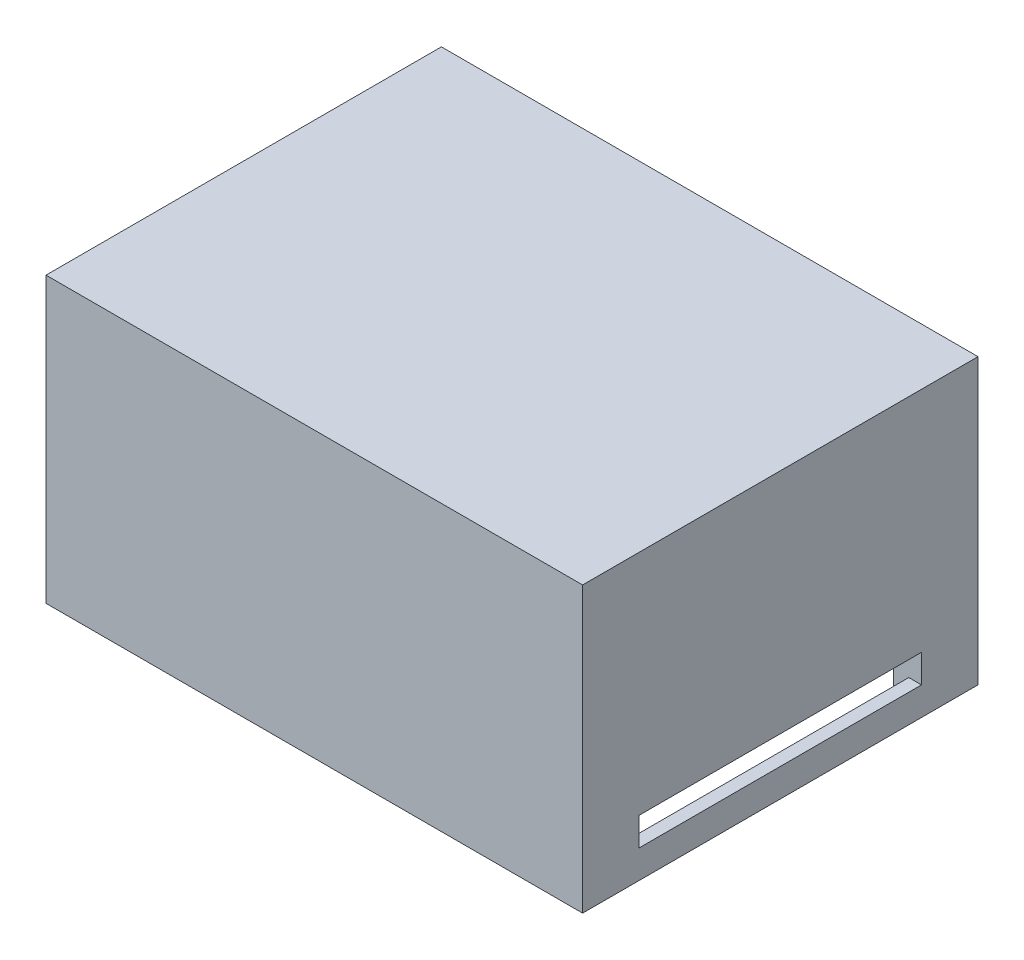
ISO-10303-21;
HEADER;
FILE_DESCRIPTION(('STEP AP214'),'2;1');
FILE_NAME('part.step','',(''),(''),'','','');
FILE_SCHEMA(('AUTOMOTIVE_DESIGN { 1 0 10303 214 1 1 1 1 }'));
ENDSEC;
DATA;
#1=APPLICATION_CONTEXT('core data for automotive mechanical design processes');
#2=APPLICATION_PROTOCOL_DEFINITION('international standard','automotive_design',2000,#1);
#3=PRODUCT_CONTEXT('',#1,'mechanical');
#4=PRODUCT('Part','Part','',(#3));
#5=PRODUCT_RELATED_PRODUCT_CATEGORY('part','',(#4));
#6=PRODUCT_DEFINITION_FORMATION('','',#4);
#7=PRODUCT_DEFINITION_CONTEXT('part definition',#1,'design');
#8=PRODUCT_DEFINITION('design','',#6,#7);
#9=PRODUCT_DEFINITION_SHAPE('','',#8);
#10=(LENGTH_UNIT() NAMED_UNIT(*) SI_UNIT(.MILLI.,.METRE.));
#11=(NAMED_UNIT(*) PLANE_ANGLE_UNIT() SI_UNIT($,.RADIAN.));
#12=(NAMED_UNIT(*) SI_UNIT($,.STERADIAN.) SOLID_ANGLE_UNIT());
#13=UNCERTAINTY_MEASURE_WITH_UNIT(LENGTH_MEASURE(1.E-05),#10,'distance_accuracy_value','');
#14=(GEOMETRIC_REPRESENTATION_CONTEXT(3) GLOBAL_UNCERTAINTY_ASSIGNED_CONTEXT((#13)) GLOBAL_UNIT_ASSIGNED_CONTEXT((#10,
#11,#12)) REPRESENTATION_CONTEXT('',''));
#15=CARTESIAN_POINT('',(0.,0.,0.));
#16=DIRECTION('',(0.,0.,1.));
#17=DIRECTION('',(1.,0.,0.));
#18=AXIS2_PLACEMENT_3D('',#15,#16,#17);
#19=CARTESIAN_POINT('',(0.,0.,17.78));
#20=DIRECTION('',(1.,0.,0.));
#21=DIRECTION('',(0.,1.,0.));
#22=AXIS2_PLACEMENT_3D('',#19,#20,#21);
#23=PLANE('',#22);
#24=DIRECTION('',(0.,-1.,0.));
#25=VECTOR('',#24,1.);
#26=CARTESIAN_POINT('',(0.,0.,-17.78));
#27=LINE('',#26,#25);
#28=CARTESIAN_POINT('',(0.,0.,-17.78));
#29=VERTEX_POINT('',#28);
#30=CARTESIAN_POINT('',(0.,-25.5651,-17.78));
#31=VERTEX_POINT('',#30);
#32=EDGE_CURVE('E214',#29,#31,#27,.T.);
#33=ORIENTED_EDGE('',*,*,#32,.T.);
#34=DIRECTION('',(0.,0.,-1.));
#35=VECTOR('',#34,1.);
#36=CARTESIAN_POINT('',(0.,-25.5651,17.78));
#37=LINE('',#36,#35);
#38=CARTESIAN_POINT('',(0.,-25.5651,17.78));
#39=VERTEX_POINT('',#38);
#40=EDGE_CURVE('E55',#39,#31,#37,.T.);
#41=ORIENTED_EDGE('',*,*,#40,.F.);
#42=DIRECTION('',(0.,-1.,0.));
#43=VECTOR('',#42,1.);
#44=CARTESIAN_POINT('',(0.,0.,17.78));
#45=LINE('',#44,#43);
#46=CARTESIAN_POINT('',(0.,0.,17.78));
#47=VERTEX_POINT('',#46);
#48=EDGE_CURVE('E229',#47,#39,#45,.T.);
#49=ORIENTED_EDGE('',*,*,#48,.F.);
#50=DIRECTION('',(0.,0.,-1.));
#51=VECTOR('',#50,1.);
#52=CARTESIAN_POINT('',(0.,0.,17.78));
#53=LINE('',#52,#51);
#54=EDGE_CURVE('E245',#47,#29,#53,.T.);
#55=ORIENTED_EDGE('',*,*,#54,.T.);
#56=EDGE_LOOP('',(#33,#41,#49,#55));
#57=FACE_BOUND('',#56,.T.);
#58=DIRECTION('',(0.,-1.,0.));
#59=VECTOR('',#58,1.);
#60=CARTESIAN_POINT('',(0.,-20.4851,-12.7));
#61=LINE('',#60,#59);
#62=CARTESIAN_POINT('',(0.,-20.4851,-12.7));
#63=VERTEX_POINT('',#62);
#64=CARTESIAN_POINT('',(0.,-23.0251,-12.7));
#65=VERTEX_POINT('',#64);
#66=EDGE_CURVE('E596',#63,#65,#61,.T.);
#67=ORIENTED_EDGE('',*,*,#66,.F.);
#68=DIRECTION('',(0.,0.,1.));
#69=VECTOR('',#68,1.);
#70=CARTESIAN_POINT('',(0.,-20.4851,-12.7));
#71=LINE('',#70,#69);
#72=CARTESIAN_POINT('',(0.,-20.4851,12.7));
#73=VERTEX_POINT('',#72);
#74=EDGE_CURVE('E367',#63,#73,#71,.T.);
#75=ORIENTED_EDGE('',*,*,#74,.T.);
#76=DIRECTION('',(0.,-1.,0.));
#77=VECTOR('',#76,1.);
#78=CARTESIAN_POINT('',(0.,-20.4851,12.7));
#79=LINE('',#78,#77);
#80=CARTESIAN_POINT('',(0.,-23.0251,12.7));
#81=VERTEX_POINT('',#80);
#82=EDGE_CURVE('E353',#73,#81,#79,.T.);
#83=ORIENTED_EDGE('',*,*,#82,.T.);
#84=DIRECTION('',(0.,0.,1.));
#85=VECTOR('',#84,1.);
#86=CARTESIAN_POINT('',(0.,-23.0251,-12.7));
#87=LINE('',#86,#85);
#88=EDGE_CURVE('E366',#65,#81,#87,.T.);
#89=ORIENTED_EDGE('',*,*,#88,.F.);
#90=EDGE_LOOP('',(#67,#75,#83,#89));
#91=FACE_BOUND('',#90,.T.);
#92=ADVANCED_FACE('F44',(#57,#91),#23,.F.);
#93=CARTESIAN_POINT('',(2.54,0.,17.78));
#94=DIRECTION('',(1.,0.,0.));
#95=DIRECTION('',(0.,1.,0.));
#96=AXIS2_PLACEMENT_3D('',#93,#94,#95);
#97=PLANE('',#96);
#98=DIRECTION('',(0.,0.,-1.));
#99=VECTOR('',#98,1.);
#100=CARTESIAN_POINT('',(2.54,-25.5651,17.78));
#101=LINE('',#100,#99);
#102=CARTESIAN_POINT('',(2.54,-25.5651,15.24));
#103=VERTEX_POINT('',#102);
#104=CARTESIAN_POINT('',(2.54,-25.5651,12.7));
#105=VERTEX_POINT('',#104);
#106=EDGE_CURVE('E215',#103,#105,#101,.T.);
#107=ORIENTED_EDGE('',*,*,#106,.T.);
#108=DIRECTION('',(0.,1.,0.));
#109=VECTOR('',#108,1.);
#110=CARTESIAN_POINT('',(2.54,-25.5651,12.7));
#111=LINE('',#110,#109);
#112=CARTESIAN_POINT('',(2.54,-20.4851,12.7));
#113=VERTEX_POINT('',#112);
#114=EDGE_CURVE('E349',#105,#113,#111,.T.);
#115=ORIENTED_EDGE('',*,*,#114,.T.);
#116=DIRECTION('',(0.,0.,1.));
#117=VECTOR('',#116,1.);
#118=CARTESIAN_POINT('',(2.54,-20.4851,-12.7));
#119=LINE('',#118,#117);
#120=CARTESIAN_POINT('',(2.54,-20.4851,-12.7));
#121=VERTEX_POINT('',#120);
#122=EDGE_CURVE('E204',#121,#113,#119,.T.);
#123=ORIENTED_EDGE('',*,*,#122,.F.);
#124=DIRECTION('',(0.,1.,0.));
#125=VECTOR('',#124,1.);
#126=CARTESIAN_POINT('',(2.54,-25.5651,-12.7));
#127=LINE('',#126,#125);
#128=CARTESIAN_POINT('',(2.54,-25.5651,-12.7));
#129=VERTEX_POINT('',#128);
#130=EDGE_CURVE('E186',#129,#121,#127,.T.);
#131=ORIENTED_EDGE('',*,*,#130,.F.);
#132=CARTESIAN_POINT('',(2.54,-25.5651,-15.24));
#133=VERTEX_POINT('',#132);
#134=EDGE_CURVE('E203',#129,#133,#101,.T.);
#135=ORIENTED_EDGE('',*,*,#134,.T.);
#136=DIRECTION('',(0.,-1.,0.));
#137=VECTOR('',#136,1.);
#138=CARTESIAN_POINT('',(2.54,0.,-15.24));
#139=LINE('',#138,#137);
#140=CARTESIAN_POINT('',(2.54,-2.54,-15.24));
#141=VERTEX_POINT('',#140);
#142=EDGE_CURVE('E221',#141,#133,#139,.T.);
#143=ORIENTED_EDGE('',*,*,#142,.F.);
#144=DIRECTION('',(0.,0.,-1.));
#145=VECTOR('',#144,1.);
#146=CARTESIAN_POINT('',(2.54,-2.54,17.78));
#147=LINE('',#146,#145);
#148=CARTESIAN_POINT('',(2.54,-2.54,15.24));
#149=VERTEX_POINT('',#148);
#150=EDGE_CURVE('E329',#149,#141,#147,.T.);
#151=ORIENTED_EDGE('',*,*,#150,.F.);
#152=DIRECTION('',(0.,-1.,0.));
#153=VECTOR('',#152,1.);
#154=CARTESIAN_POINT('',(2.54,0.,15.24));
#155=LINE('',#154,#153);
#156=EDGE_CURVE('E228',#149,#103,#155,.T.);
#157=ORIENTED_EDGE('',*,*,#156,.T.);
#158=EDGE_LOOP('',(#107,#115,#123,#131,#135,#143,#151,#157));
#159=FACE_BOUND('',#158,.T.);
#160=ADVANCED_FACE('F200',(#159),#97,.T.);
#161=CARTESIAN_POINT('',(0.,-25.5651,17.78));
#162=DIRECTION('',(0.,1.,0.));
#163=DIRECTION('',(0.,0.,1.));
#164=AXIS2_PLACEMENT_3D('',#161,#162,#163);
#165=PLANE('',#164);
#166=DIRECTION('',(0.,0.,1.));
#167=VECTOR('',#166,1.);
#168=CARTESIAN_POINT('',(0.508,-25.5651,-12.7));
#169=LINE('',#168,#167);
#170=CARTESIAN_POINT('',(0.508,-25.5651,-12.7));
#171=VERTEX_POINT('',#170);
#172=CARTESIAN_POINT('',(0.508,-25.5651,12.7));
#173=VERTEX_POINT('',#172);
#174=EDGE_CURVE('E324',#171,#173,#169,.T.);
#175=ORIENTED_EDGE('',*,*,#174,.T.);
#176=DIRECTION('',(1.,0.,0.));
#177=VECTOR('',#176,1.);
#178=CARTESIAN_POINT('',(0.508,-25.5651,12.7));
#179=LINE('',#178,#177);
#180=EDGE_CURVE('E346',#173,#105,#179,.T.);
#181=ORIENTED_EDGE('',*,*,#180,.T.);
#182=ORIENTED_EDGE('',*,*,#106,.F.);
#183=DIRECTION('',(1.,0.,0.));
#184=VECTOR('',#183,1.);
#185=CARTESIAN_POINT('',(0.,-25.5651,15.24));
#186=LINE('',#185,#184);
#187=CARTESIAN_POINT('',(45.72,-25.5651,15.24));
#188=VERTEX_POINT('',#187);
#189=EDGE_CURVE('E226',#103,#188,#186,.T.);
#190=ORIENTED_EDGE('',*,*,#189,.T.);
#191=DIRECTION('',(0.,0.,-1.));
#192=VECTOR('',#191,1.);
#193=CARTESIAN_POINT('',(45.72,-25.5651,17.78));
#194=LINE('',#193,#192);
#195=CARTESIAN_POINT('',(45.72,-25.5651,12.7));
#196=VERTEX_POINT('',#195);
#197=EDGE_CURVE('E213',#188,#196,#194,.T.);
#198=ORIENTED_EDGE('',*,*,#197,.T.);
#199=DIRECTION('',(1.,0.,0.));
#200=VECTOR('',#199,1.);
#201=CARTESIAN_POINT('',(45.72,-25.5651,12.7));
#202=LINE('',#201,#200);
#203=CARTESIAN_POINT('',(47.752,-25.5651,12.7));
#204=VERTEX_POINT('',#203);
#205=EDGE_CURVE('E358',#196,#204,#202,.T.);
#206=ORIENTED_EDGE('',*,*,#205,.T.);
#207=DIRECTION('',(0.,0.,1.));
#208=VECTOR('',#207,1.);
#209=CARTESIAN_POINT('',(47.752,-25.5651,-12.7));
#210=LINE('',#209,#208);
#211=CARTESIAN_POINT('',(47.752,-25.5651,-12.7));
#212=VERTEX_POINT('',#211);
#213=EDGE_CURVE('E372',#212,#204,#210,.T.);
#214=ORIENTED_EDGE('',*,*,#213,.F.);
#215=DIRECTION('',(1.,0.,0.));
#216=VECTOR('',#215,1.);
#217=CARTESIAN_POINT('',(45.72,-25.5651,-12.7));
#218=LINE('',#217,#216);
#219=CARTESIAN_POINT('',(45.72,-25.5651,-12.7));
#220=VERTEX_POINT('',#219);
#221=EDGE_CURVE('E386',#220,#212,#218,.T.);
#222=ORIENTED_EDGE('',*,*,#221,.F.);
#223=CARTESIAN_POINT('',(45.72,-25.5651,-15.24));
#224=VERTEX_POINT('',#223);
#225=EDGE_CURVE('E220',#220,#224,#194,.T.);
#226=ORIENTED_EDGE('',*,*,#225,.T.);
#227=DIRECTION('',(1.,0.,0.));
#228=VECTOR('',#227,1.);
#229=CARTESIAN_POINT('',(0.,-25.5651,-15.24));
#230=LINE('',#229,#228);
#231=EDGE_CURVE('E211',#133,#224,#230,.T.);
#232=ORIENTED_EDGE('',*,*,#231,.F.);
#233=ORIENTED_EDGE('',*,*,#134,.F.);
#234=DIRECTION('',(1.,0.,0.));
#235=VECTOR('',#234,1.);
#236=CARTESIAN_POINT('',(0.508,-25.5651,-12.7));
#237=LINE('',#236,#235);
#238=EDGE_CURVE('E185',#171,#129,#237,.T.);
#239=ORIENTED_EDGE('',*,*,#238,.F.);
#240=EDGE_LOOP('',(#175,#181,#182,#190,#198,#206,#214,#222,#226,#232,#233,#239));
#241=FACE_BOUND('',#240,.T.);
#242=DIRECTION('',(1.,0.,0.));
#243=VECTOR('',#242,1.);
#244=CARTESIAN_POINT('',(0.,-25.5651,-17.78));
#245=LINE('',#244,#243);
#246=CARTESIAN_POINT('',(48.26,-25.5651,-17.78));
#247=VERTEX_POINT('',#246);
#248=EDGE_CURVE('E244',#31,#247,#245,.T.);
#249=ORIENTED_EDGE('',*,*,#248,.T.);
#250=DIRECTION('',(0.,0.,-1.));
#251=VECTOR('',#250,1.);
#252=CARTESIAN_POINT('',(48.26,-25.5651,17.78));
#253=LINE('',#252,#251);
#254=CARTESIAN_POINT('',(48.26,-25.5651,17.78));
#255=VERTEX_POINT('',#254);
#256=EDGE_CURVE('E258',#255,#247,#253,.T.);
#257=ORIENTED_EDGE('',*,*,#256,.F.);
#258=DIRECTION('',(1.,0.,0.));
#259=VECTOR('',#258,1.);
#260=CARTESIAN_POINT('',(0.,-25.5651,17.78));
#261=LINE('',#260,#259);
#262=EDGE_CURVE('E232',#39,#255,#261,.T.);
#263=ORIENTED_EDGE('',*,*,#262,.F.);
#264=ORIENTED_EDGE('',*,*,#40,.T.);
#265=EDGE_LOOP('',(#249,#257,#263,#264));
#266=FACE_BOUND('',#265,.T.);
#267=ADVANCED_FACE('F208',(#241,#266),#165,.F.);
#268=CARTESIAN_POINT('',(48.26,0.,17.78));
#269=DIRECTION('',(1.,0.,0.));
#270=DIRECTION('',(0.,0.,-1.));
#271=AXIS2_PLACEMENT_3D('',#268,#269,#270);
#272=PLANE('',#271);
#273=DIRECTION('',(0.,1.,0.));
#274=VECTOR('',#273,1.);
#275=CARTESIAN_POINT('',(48.26,-23.0251,-12.7));
#276=LINE('',#275,#274);
#277=CARTESIAN_POINT('',(48.26,-23.0251,-12.7));
#278=VERTEX_POINT('',#277);
#279=CARTESIAN_POINT('',(48.26,-20.4851,-12.7));
#280=VERTEX_POINT('',#279);
#281=EDGE_CURVE('E406',#278,#280,#276,.T.);
#282=ORIENTED_EDGE('',*,*,#281,.F.);
#283=DIRECTION('',(0.,0.,1.));
#284=VECTOR('',#283,1.);
#285=CARTESIAN_POINT('',(48.26,-23.0251,-12.7));
#286=LINE('',#285,#284);
#287=CARTESIAN_POINT('',(48.26,-23.0251,12.7));
#288=VERTEX_POINT('',#287);
#289=EDGE_CURVE('E377',#278,#288,#286,.T.);
#290=ORIENTED_EDGE('',*,*,#289,.T.);
#291=DIRECTION('',(0.,1.,0.));
#292=VECTOR('',#291,1.);
#293=CARTESIAN_POINT('',(48.26,-23.0251,12.7));
#294=LINE('',#293,#292);
#295=CARTESIAN_POINT('',(48.26,-20.4851,12.7));
#296=VERTEX_POINT('',#295);
#297=EDGE_CURVE('E391',#288,#296,#294,.T.);
#298=ORIENTED_EDGE('',*,*,#297,.T.);
#299=DIRECTION('',(0.,0.,1.));
#300=VECTOR('',#299,1.);
#301=CARTESIAN_POINT('',(48.26,-20.4851,-12.7));
#302=LINE('',#301,#300);
#303=EDGE_CURVE('E385',#280,#296,#302,.T.);
#304=ORIENTED_EDGE('',*,*,#303,.F.);
#305=EDGE_LOOP('',(#282,#290,#298,#304));
#306=FACE_BOUND('',#305,.T.);
#307=DIRECTION('',(0.,-1.,0.));
#308=VECTOR('',#307,1.);
#309=CARTESIAN_POINT('',(48.26,0.,-17.78));
#310=LINE('',#309,#308);
#311=CARTESIAN_POINT('',(48.26,0.,-17.78));
#312=VERTEX_POINT('',#311);
#313=EDGE_CURVE('E247',#312,#247,#310,.T.);
#314=ORIENTED_EDGE('',*,*,#313,.F.);
#315=DIRECTION('',(0.,0.,-1.));
#316=VECTOR('',#315,1.);
#317=CARTESIAN_POINT('',(48.26,0.,17.78));
#318=LINE('',#317,#316);
#319=CARTESIAN_POINT('',(48.26,0.,17.78));
#320=VERTEX_POINT('',#319);
#321=EDGE_CURVE('E255',#320,#312,#318,.T.);
#322=ORIENTED_EDGE('',*,*,#321,.F.);
#323=DIRECTION('',(0.,-1.,0.));
#324=VECTOR('',#323,1.);
#325=CARTESIAN_POINT('',(48.26,0.,17.78));
#326=LINE('',#325,#324);
#327=EDGE_CURVE('E237',#320,#255,#326,.T.);
#328=ORIENTED_EDGE('',*,*,#327,.T.);
#329=ORIENTED_EDGE('',*,*,#256,.T.);
#330=EDGE_LOOP('',(#314,#322,#328,#329));
#331=FACE_BOUND('',#330,.T.);
#332=ADVANCED_FACE('F272',(#306,#331),#272,.T.);
#333=CARTESIAN_POINT('',(0.,0.,17.78));
#334=DIRECTION('',(0.,1.,0.));
#335=DIRECTION('',(0.,0.,1.));
#336=AXIS2_PLACEMENT_3D('',#333,#334,#335);
#337=PLANE('',#336);
#338=DIRECTION('',(1.,0.,0.));
#339=VECTOR('',#338,1.);
#340=CARTESIAN_POINT('',(0.,0.,-17.78));
#341=LINE('',#340,#339);
#342=EDGE_CURVE('E235',#29,#312,#341,.T.);
#343=ORIENTED_EDGE('',*,*,#342,.F.);
#344=ORIENTED_EDGE('',*,*,#54,.F.);
#345=DIRECTION('',(1.,0.,0.));
#346=VECTOR('',#345,1.);
#347=CARTESIAN_POINT('',(0.,0.,17.78));
#348=LINE('',#347,#346);
#349=EDGE_CURVE('E239',#47,#320,#348,.T.);
#350=ORIENTED_EDGE('',*,*,#349,.T.);
#351=ORIENTED_EDGE('',*,*,#321,.T.);
#352=EDGE_LOOP('',(#343,#344,#350,#351));
#353=FACE_BOUND('',#352,.T.);
#354=ADVANCED_FACE('F268',(#353),#337,.T.);
#355=CARTESIAN_POINT('',(0.,0.,17.78));
#356=DIRECTION('',(0.,0.,1.));
#357=DIRECTION('',(1.,0.,0.));
#358=AXIS2_PLACEMENT_3D('',#355,#356,#357);
#359=PLANE('',#358);
#360=ORIENTED_EDGE('',*,*,#48,.T.);
#361=ORIENTED_EDGE('',*,*,#262,.T.);
#362=ORIENTED_EDGE('',*,*,#327,.F.);
#363=ORIENTED_EDGE('',*,*,#349,.F.);
#364=EDGE_LOOP('',(#360,#361,#362,#363));
#365=FACE_BOUND('',#364,.T.);
#366=ADVANCED_FACE('F274',(#365),#359,.T.);
#367=CARTESIAN_POINT('',(0.,0.,-17.78));
#368=DIRECTION('',(0.,0.,1.));
#369=DIRECTION('',(1.,0.,0.));
#370=AXIS2_PLACEMENT_3D('',#367,#368,#369);
#371=PLANE('',#370);
#372=ORIENTED_EDGE('',*,*,#32,.F.);
#373=ORIENTED_EDGE('',*,*,#342,.T.);
#374=ORIENTED_EDGE('',*,*,#313,.T.);
#375=ORIENTED_EDGE('',*,*,#248,.F.);
#376=EDGE_LOOP('',(#372,#373,#374,#375));
#377=FACE_BOUND('',#376,.T.);
#378=ADVANCED_FACE('F266',(#377),#371,.F.);
#379=CARTESIAN_POINT('',(45.72,0.,17.78));
#380=DIRECTION('',(1.,0.,0.));
#381=DIRECTION('',(0.,0.,-1.));
#382=AXIS2_PLACEMENT_3D('',#379,#380,#381);
#383=PLANE('',#382);
#384=DIRECTION('',(0.,0.,1.));
#385=VECTOR('',#384,1.);
#386=CARTESIAN_POINT('',(45.72,-20.4851,-12.7));
#387=LINE('',#386,#385);
#388=CARTESIAN_POINT('',(45.72,-20.4851,-12.7));
#389=VERTEX_POINT('',#388);
#390=CARTESIAN_POINT('',(45.72,-20.4851,12.7));
#391=VERTEX_POINT('',#390);
#392=EDGE_CURVE('E383',#389,#391,#387,.T.);
#393=ORIENTED_EDGE('',*,*,#392,.T.);
#394=DIRECTION('',(0.,-1.,0.));
#395=VECTOR('',#394,1.);
#396=CARTESIAN_POINT('',(45.72,-20.4851,12.7));
#397=LINE('',#396,#395);
#398=EDGE_CURVE('E387',#391,#196,#397,.T.);
#399=ORIENTED_EDGE('',*,*,#398,.T.);
#400=ORIENTED_EDGE('',*,*,#197,.F.);
#401=DIRECTION('',(0.,-1.,0.));
#402=VECTOR('',#401,1.);
#403=CARTESIAN_POINT('',(45.72,0.,15.24));
#404=LINE('',#403,#402);
#405=CARTESIAN_POINT('',(45.72,-2.54,15.24));
#406=VERTEX_POINT('',#405);
#407=EDGE_CURVE('E222',#406,#188,#404,.T.);
#408=ORIENTED_EDGE('',*,*,#407,.F.);
#409=DIRECTION('',(0.,0.,-1.));
#410=VECTOR('',#409,1.);
#411=CARTESIAN_POINT('',(45.72,-2.54,17.78));
#412=LINE('',#411,#410);
#413=CARTESIAN_POINT('',(45.72,-2.54,-15.24));
#414=VERTEX_POINT('',#413);
#415=EDGE_CURVE('E335',#406,#414,#412,.T.);
#416=ORIENTED_EDGE('',*,*,#415,.T.);
#417=DIRECTION('',(0.,-1.,0.));
#418=VECTOR('',#417,1.);
#419=CARTESIAN_POINT('',(45.72,0.,-15.24));
#420=LINE('',#419,#418);
#421=EDGE_CURVE('E224',#414,#224,#420,.T.);
#422=ORIENTED_EDGE('',*,*,#421,.T.);
#423=ORIENTED_EDGE('',*,*,#225,.F.);
#424=DIRECTION('',(0.,-1.,0.));
#425=VECTOR('',#424,1.);
#426=CARTESIAN_POINT('',(45.72,-20.4851,-12.7));
#427=LINE('',#426,#425);
#428=EDGE_CURVE('E376',#389,#220,#427,.T.);
#429=ORIENTED_EDGE('',*,*,#428,.F.);
#430=EDGE_LOOP('',(#393,#399,#400,#408,#416,#422,#423,#429));
#431=FACE_BOUND('',#430,.T.);
#432=ADVANCED_FACE('F285',(#431),#383,.F.);
#433=CARTESIAN_POINT('',(0.,-2.54,17.78));
#434=DIRECTION('',(0.,1.,0.));
#435=DIRECTION('',(0.,0.,1.));
#436=AXIS2_PLACEMENT_3D('',#433,#434,#435);
#437=PLANE('',#436);
#438=CARTESIAN_POINT('',(10.16,-2.54,0.));
#439=DIRECTION('',(0.,1.,0.));
#440=DIRECTION('',(0.,0.,1.));
#441=AXIS2_PLACEMENT_3D('',#438,#439,#440);
#442=CIRCLE('',#441,1.5875);
#443=CARTESIAN_POINT('',(10.16,-2.54,1.5875));
#444=VERTEX_POINT('',#443);
#445=EDGE_CURVE('E11',#444,#444,#442,.F.);
#446=ORIENTED_EDGE('',*,*,#445,.F.);
#447=EDGE_LOOP('',(#446));
#448=FACE_BOUND('',#447,.T.);
#449=DIRECTION('',(1.,0.,0.));
#450=VECTOR('',#449,1.);
#451=CARTESIAN_POINT('',(0.,-2.54,-15.24));
#452=LINE('',#451,#450);
#453=EDGE_CURVE('E321',#141,#414,#452,.T.);
#454=ORIENTED_EDGE('',*,*,#453,.T.);
#455=ORIENTED_EDGE('',*,*,#415,.F.);
#456=DIRECTION('',(1.,0.,0.));
#457=VECTOR('',#456,1.);
#458=CARTESIAN_POINT('',(0.,-2.54,15.24));
#459=LINE('',#458,#457);
#460=EDGE_CURVE('E334',#149,#406,#459,.T.);
#461=ORIENTED_EDGE('',*,*,#460,.F.);
#462=ORIENTED_EDGE('',*,*,#150,.T.);
#463=EDGE_LOOP('',(#454,#455,#461,#462));
#464=FACE_BOUND('',#463,.T.);
#465=ADVANCED_FACE('F303',(#448,#464),#437,.F.);
#466=CARTESIAN_POINT('',(0.,0.,15.24));
#467=DIRECTION('',(0.,0.,1.));
#468=DIRECTION('',(1.,0.,0.));
#469=AXIS2_PLACEMENT_3D('',#466,#467,#468);
#470=PLANE('',#469);
#471=ORIENTED_EDGE('',*,*,#156,.F.);
#472=ORIENTED_EDGE('',*,*,#460,.T.);
#473=ORIENTED_EDGE('',*,*,#407,.T.);
#474=ORIENTED_EDGE('',*,*,#189,.F.);
#475=EDGE_LOOP('',(#471,#472,#473,#474));
#476=FACE_BOUND('',#475,.T.);
#477=ADVANCED_FACE('F301',(#476),#470,.F.);
#478=CARTESIAN_POINT('',(0.,0.,-15.24));
#479=DIRECTION('',(0.,0.,1.));
#480=DIRECTION('',(1.,0.,0.));
#481=AXIS2_PLACEMENT_3D('',#478,#479,#480);
#482=PLANE('',#481);
#483=ORIENTED_EDGE('',*,*,#142,.T.);
#484=ORIENTED_EDGE('',*,*,#231,.T.);
#485=ORIENTED_EDGE('',*,*,#421,.F.);
#486=ORIENTED_EDGE('',*,*,#453,.F.);
#487=EDGE_LOOP('',(#483,#484,#485,#486));
#488=FACE_BOUND('',#487,.T.);
#489=ADVANCED_FACE('F306',(#488),#482,.T.);
#490=CARTESIAN_POINT('',(10.16,-27.94,0.));
#491=DIRECTION('',(0.,1.,0.));
#492=DIRECTION('',(0.,0.,1.));
#493=AXIS2_PLACEMENT_3D('',#490,#491,#492);
#494=CYLINDRICAL_SURFACE('',#493,1.5875);
#495=CARTESIAN_POINT('',(10.16,-27.94,0.));
#496=DIRECTION('',(0.,-1.,0.));
#497=DIRECTION('',(0.,0.,-1.));
#498=AXIS2_PLACEMENT_3D('',#495,#496,#497);
#499=CIRCLE('',#498,1.5875);
#500=CARTESIAN_POINT('',(10.16,-27.94,-1.5875));
#501=VERTEX_POINT('',#500);
#502=EDGE_CURVE('E325',#501,#501,#499,.T.);
#503=ORIENTED_EDGE('',*,*,#502,.F.);
#504=EDGE_LOOP('',(#503));
#505=FACE_BOUND('',#504,.T.);
#506=ORIENTED_EDGE('',*,*,#445,.T.);
#507=EDGE_LOOP('',(#506));
#508=FACE_BOUND('',#507,.T.);
#509=ADVANCED_FACE('F300',(#505,#508),#494,.T.);
#510=CARTESIAN_POINT('',(10.16,-27.94,0.));
#511=DIRECTION('',(0.,-1.,0.));
#512=DIRECTION('',(0.,0.,-1.));
#513=AXIS2_PLACEMENT_3D('',#510,#511,#512);
#514=PLANE('',#513);
#515=ORIENTED_EDGE('',*,*,#502,.T.);
#516=EDGE_LOOP('',(#515));
#517=FACE_BOUND('',#516,.T.);
#518=ADVANCED_FACE('F312',(#517),#514,.T.);
#519=CARTESIAN_POINT('',(48.26,-20.4851,-12.7));
#520=DIRECTION('',(0.,1.,0.));
#521=DIRECTION('',(0.,0.,1.));
#522=AXIS2_PLACEMENT_3D('',#519,#520,#521);
#523=PLANE('',#522);
#524=DIRECTION('',(-1.,0.,0.));
#525=VECTOR('',#524,1.);
#526=CARTESIAN_POINT('',(48.26,-20.4851,12.7));
#527=LINE('',#526,#525);
#528=EDGE_CURVE('E69',#296,#391,#527,.T.);
#529=ORIENTED_EDGE('',*,*,#528,.T.);
#530=ORIENTED_EDGE('',*,*,#392,.F.);
#531=DIRECTION('',(-1.,0.,0.));
#532=VECTOR('',#531,1.);
#533=CARTESIAN_POINT('',(48.26,-20.4851,-12.7));
#534=LINE('',#533,#532);
#535=EDGE_CURVE('E401',#280,#389,#534,.T.);
#536=ORIENTED_EDGE('',*,*,#535,.F.);
#537=ORIENTED_EDGE('',*,*,#303,.T.);
#538=EDGE_LOOP('',(#529,#530,#536,#537));
#539=FACE_BOUND('',#538,.T.);
#540=ADVANCED_FACE('F431',(#539),#523,.F.);
#541=CARTESIAN_POINT('',(47.117,-23.0251,-12.7));
#542=DIRECTION('',(0.,-1.,0.));
#543=DIRECTION('',(1.,0.,0.));
#544=AXIS2_PLACEMENT_3D('',#541,#542,#543);
#545=PLANE('',#544);
#546=DIRECTION('',(1.,0.,0.));
#547=VECTOR('',#546,1.);
#548=CARTESIAN_POINT('',(47.117,-23.0251,12.7));
#549=LINE('',#548,#547);
#550=CARTESIAN_POINT('',(47.117,-23.0251,12.7));
#551=VERTEX_POINT('',#550);
#552=EDGE_CURVE('E393',#551,#288,#549,.T.);
#553=ORIENTED_EDGE('',*,*,#552,.T.);
#554=ORIENTED_EDGE('',*,*,#289,.F.);
#555=DIRECTION('',(1.,0.,0.));
#556=VECTOR('',#555,1.);
#557=CARTESIAN_POINT('',(47.117,-23.0251,-12.7));
#558=LINE('',#557,#556);
#559=CARTESIAN_POINT('',(47.117,-23.0251,-12.7));
#560=VERTEX_POINT('',#559);
#561=EDGE_CURVE('E408',#560,#278,#558,.T.);
#562=ORIENTED_EDGE('',*,*,#561,.F.);
#563=DIRECTION('',(0.,0.,1.));
#564=VECTOR('',#563,1.);
#565=CARTESIAN_POINT('',(47.117,-23.0251,-12.7));
#566=LINE('',#565,#564);
#567=EDGE_CURVE('E380',#560,#551,#566,.T.);
#568=ORIENTED_EDGE('',*,*,#567,.T.);
#569=EDGE_LOOP('',(#553,#554,#562,#568));
#570=FACE_BOUND('',#569,.T.);
#571=ADVANCED_FACE('F422',(#570),#545,.F.);
#572=CARTESIAN_POINT('',(47.752,-25.5651,-12.7));
#573=DIRECTION('',(0.970142500145332,0.242535625036331,0.));
#574=DIRECTION('',(-0.242535625036331,0.970142500145332,0.));
#575=AXIS2_PLACEMENT_3D('',#572,#573,#574);
#576=PLANE('',#575);
#577=DIRECTION('',(-0.242535625036331,0.970142500145332,0.));
#578=VECTOR('',#577,1.);
#579=CARTESIAN_POINT('',(47.752,-25.5651,12.7));
#580=LINE('',#579,#578);
#581=EDGE_CURVE('E399',#204,#551,#580,.T.);
#582=ORIENTED_EDGE('',*,*,#581,.T.);
#583=ORIENTED_EDGE('',*,*,#567,.F.);
#584=DIRECTION('',(-0.242535625036331,0.970142500145332,0.));
#585=VECTOR('',#584,1.);
#586=CARTESIAN_POINT('',(47.752,-25.5651,-12.7));
#587=LINE('',#586,#585);
#588=EDGE_CURVE('E414',#212,#560,#587,.T.);
#589=ORIENTED_EDGE('',*,*,#588,.F.);
#590=ORIENTED_EDGE('',*,*,#213,.T.);
#591=EDGE_LOOP('',(#582,#583,#589,#590));
#592=FACE_BOUND('',#591,.T.);
#593=ADVANCED_FACE('F423',(#592),#576,.F.);
#594=CARTESIAN_POINT('',(0.,0.,-12.7));
#595=DIRECTION('',(0.,0.,1.));
#596=DIRECTION('',(1.,0.,0.));
#597=AXIS2_PLACEMENT_3D('',#594,#595,#596);
#598=PLANE('',#597);
#599=ORIENTED_EDGE('',*,*,#221,.T.);
#600=ORIENTED_EDGE('',*,*,#588,.T.);
#601=ORIENTED_EDGE('',*,*,#561,.T.);
#602=ORIENTED_EDGE('',*,*,#281,.T.);
#603=ORIENTED_EDGE('',*,*,#535,.T.);
#604=ORIENTED_EDGE('',*,*,#428,.T.);
#605=EDGE_LOOP('',(#599,#600,#601,#602,#603,#604));
#606=FACE_BOUND('',#605,.T.);
#607=ADVANCED_FACE('F416',(#606),#598,.T.);
#608=CARTESIAN_POINT('',(0.,0.,12.7));
#609=DIRECTION('',(0.,0.,1.));
#610=DIRECTION('',(1.,0.,0.));
#611=AXIS2_PLACEMENT_3D('',#608,#609,#610);
#612=PLANE('',#611);
#613=ORIENTED_EDGE('',*,*,#205,.F.);
#614=ORIENTED_EDGE('',*,*,#398,.F.);
#615=ORIENTED_EDGE('',*,*,#528,.F.);
#616=ORIENTED_EDGE('',*,*,#297,.F.);
#617=ORIENTED_EDGE('',*,*,#552,.F.);
#618=ORIENTED_EDGE('',*,*,#581,.F.);
#619=EDGE_LOOP('',(#613,#614,#615,#616,#617,#618));
#620=FACE_BOUND('',#619,.T.);
#621=ADVANCED_FACE('F421',(#620),#612,.F.);
#622=CARTESIAN_POINT('',(0.508,-25.5651,-12.7));
#623=DIRECTION('',(-0.970142500145332,0.242535625036333,0.));
#624=DIRECTION('',(-0.242535625036333,-0.970142500145332,0.));
#625=AXIS2_PLACEMENT_3D('',#622,#623,#624);
#626=PLANE('',#625);
#627=DIRECTION('',(-0.242535625036333,-0.970142500145332,0.));
#628=VECTOR('',#627,1.);
#629=CARTESIAN_POINT('',(0.508,-25.5651,12.7));
#630=LINE('',#629,#628);
#631=CARTESIAN_POINT('',(1.143,-23.0251,12.7));
#632=VERTEX_POINT('',#631);
#633=EDGE_CURVE('E195',#632,#173,#630,.T.);
#634=ORIENTED_EDGE('',*,*,#633,.T.);
#635=ORIENTED_EDGE('',*,*,#174,.F.);
#636=DIRECTION('',(-0.242535625036333,-0.970142500145332,0.));
#637=VECTOR('',#636,1.);
#638=CARTESIAN_POINT('',(0.508,-25.5651,-12.7));
#639=LINE('',#638,#637);
#640=CARTESIAN_POINT('',(1.143,-23.0251,-12.7));
#641=VERTEX_POINT('',#640);
#642=EDGE_CURVE('E189',#641,#171,#639,.T.);
#643=ORIENTED_EDGE('',*,*,#642,.F.);
#644=DIRECTION('',(0.,0.,1.));
#645=VECTOR('',#644,1.);
#646=CARTESIAN_POINT('',(1.143,-23.0251,-12.7));
#647=LINE('',#646,#645);
#648=EDGE_CURVE('E368',#641,#632,#647,.T.);
#649=ORIENTED_EDGE('',*,*,#648,.T.);
#650=EDGE_LOOP('',(#634,#635,#643,#649));
#651=FACE_BOUND('',#650,.T.);
#652=ADVANCED_FACE('F444',(#651),#626,.F.);
#653=CARTESIAN_POINT('',(1.143,-23.0251,-12.7));
#654=DIRECTION('',(0.,-1.,0.));
#655=DIRECTION('',(0.,0.,-1.));
#656=AXIS2_PLACEMENT_3D('',#653,#654,#655);
#657=PLANE('',#656);
#658=DIRECTION('',(1.,0.,0.));
#659=VECTOR('',#658,1.);
#660=CARTESIAN_POINT('',(1.143,-23.0251,12.7));
#661=LINE('',#660,#659);
#662=EDGE_CURVE('E56',#81,#632,#661,.T.);
#663=ORIENTED_EDGE('',*,*,#662,.T.);
#664=ORIENTED_EDGE('',*,*,#648,.F.);
#665=DIRECTION('',(1.,0.,0.));
#666=VECTOR('',#665,1.);
#667=CARTESIAN_POINT('',(1.143,-23.0251,-12.7));
#668=LINE('',#667,#666);
#669=EDGE_CURVE('E593',#65,#641,#668,.T.);
#670=ORIENTED_EDGE('',*,*,#669,.F.);
#671=ORIENTED_EDGE('',*,*,#88,.T.);
#672=EDGE_LOOP('',(#663,#664,#670,#671));
#673=FACE_BOUND('',#672,.T.);
#674=ADVANCED_FACE('F455',(#673),#657,.F.);
#675=CARTESIAN_POINT('',(2.54,-20.4851,-12.7));
#676=DIRECTION('',(0.,1.,0.));
#677=DIRECTION('',(0.,0.,1.));
#678=AXIS2_PLACEMENT_3D('',#675,#676,#677);
#679=PLANE('',#678);
#680=DIRECTION('',(-1.,0.,0.));
#681=VECTOR('',#680,1.);
#682=CARTESIAN_POINT('',(2.54,-20.4851,12.7));
#683=LINE('',#682,#681);
#684=EDGE_CURVE('E351',#113,#73,#683,.T.);
#685=ORIENTED_EDGE('',*,*,#684,.T.);
#686=ORIENTED_EDGE('',*,*,#74,.F.);
#687=DIRECTION('',(-1.,0.,0.));
#688=VECTOR('',#687,1.);
#689=CARTESIAN_POINT('',(2.54,-20.4851,-12.7));
#690=LINE('',#689,#688);
#691=EDGE_CURVE('E202',#121,#63,#690,.T.);
#692=ORIENTED_EDGE('',*,*,#691,.F.);
#693=ORIENTED_EDGE('',*,*,#122,.T.);
#694=EDGE_LOOP('',(#685,#686,#692,#693));
#695=FACE_BOUND('',#694,.T.);
#696=ADVANCED_FACE('F453',(#695),#679,.F.);
#697=CARTESIAN_POINT('',(0.,0.,-12.7));
#698=DIRECTION('',(0.,0.,1.));
#699=DIRECTION('',(1.,0.,0.));
#700=AXIS2_PLACEMENT_3D('',#697,#698,#699);
#701=PLANE('',#700);
#702=ORIENTED_EDGE('',*,*,#238,.T.);
#703=ORIENTED_EDGE('',*,*,#130,.T.);
#704=ORIENTED_EDGE('',*,*,#691,.T.);
#705=ORIENTED_EDGE('',*,*,#66,.T.);
#706=ORIENTED_EDGE('',*,*,#669,.T.);
#707=ORIENTED_EDGE('',*,*,#642,.T.);
#708=EDGE_LOOP('',(#702,#703,#704,#705,#706,#707));
#709=FACE_BOUND('',#708,.T.);
#710=ADVANCED_FACE('F184',(#709),#701,.T.);
#711=CARTESIAN_POINT('',(0.,0.,12.7));
#712=DIRECTION('',(0.,0.,1.));
#713=DIRECTION('',(1.,0.,0.));
#714=AXIS2_PLACEMENT_3D('',#711,#712,#713);
#715=PLANE('',#714);
#716=ORIENTED_EDGE('',*,*,#180,.F.);
#717=ORIENTED_EDGE('',*,*,#633,.F.);
#718=ORIENTED_EDGE('',*,*,#662,.F.);
#719=ORIENTED_EDGE('',*,*,#82,.F.);
#720=ORIENTED_EDGE('',*,*,#684,.F.);
#721=ORIENTED_EDGE('',*,*,#114,.F.);
#722=EDGE_LOOP('',(#716,#717,#718,#719,#720,#721));
#723=FACE_BOUND('',#722,.T.);
#724=ADVANCED_FACE('F465',(#723),#715,.F.);
#725=CLOSED_SHELL('',(#92,#160,#267,#332,#354,#366,#378,#432,#465,#477,#489,#509,#518,#540,#571,
#593,#607,#621,#652,#674,#696,#710,#724));
#726=MANIFOLD_SOLID_BREP('B2',#725);
#727=ADVANCED_BREP_SHAPE_REPRESENTATION('',(#18,#726),#14);
#728=SHAPE_DEFINITION_REPRESENTATION(#9,#727);
ENDSEC;
END-ISO-10303-21;
